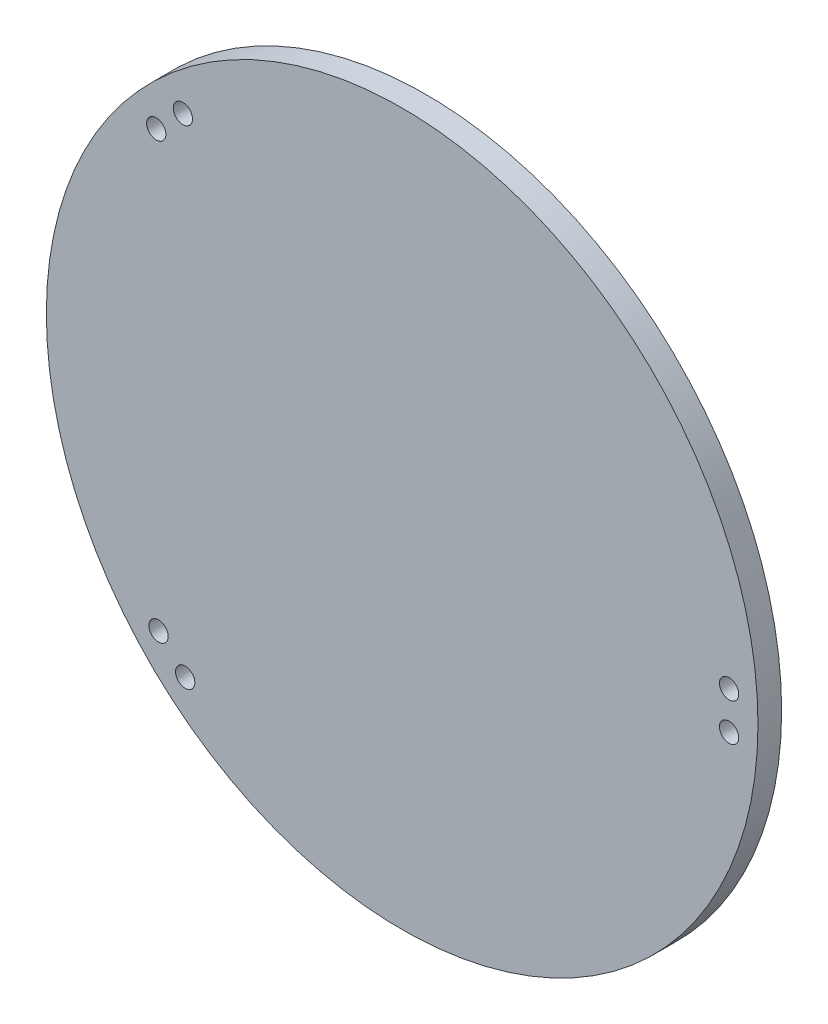
ISO-10303-21;
HEADER;
FILE_DESCRIPTION(('STEP AP214'),'2;1');
FILE_NAME('part.step','',(''),(''),'','','');
FILE_SCHEMA(('AUTOMOTIVE_DESIGN { 1 0 10303 214 1 1 1 1 }'));
ENDSEC;
DATA;
#1=APPLICATION_CONTEXT('core data for automotive mechanical design processes');
#2=APPLICATION_PROTOCOL_DEFINITION('international standard','automotive_design',2000,#1);
#3=PRODUCT_CONTEXT('',#1,'mechanical');
#4=PRODUCT('Part','Part','',(#3));
#5=PRODUCT_RELATED_PRODUCT_CATEGORY('part','',(#4));
#6=PRODUCT_DEFINITION_FORMATION('','',#4);
#7=PRODUCT_DEFINITION_CONTEXT('part definition',#1,'design');
#8=PRODUCT_DEFINITION('design','',#6,#7);
#9=PRODUCT_DEFINITION_SHAPE('','',#8);
#10=(LENGTH_UNIT() NAMED_UNIT(*) SI_UNIT(.MILLI.,.METRE.));
#11=(NAMED_UNIT(*) PLANE_ANGLE_UNIT() SI_UNIT($,.RADIAN.));
#12=(NAMED_UNIT(*) SI_UNIT($,.STERADIAN.) SOLID_ANGLE_UNIT());
#13=UNCERTAINTY_MEASURE_WITH_UNIT(LENGTH_MEASURE(1.E-05),#10,'distance_accuracy_value','');
#14=(GEOMETRIC_REPRESENTATION_CONTEXT(3) GLOBAL_UNCERTAINTY_ASSIGNED_CONTEXT((#13)) GLOBAL_UNIT_ASSIGNED_CONTEXT((#10,
#11,#12)) REPRESENTATION_CONTEXT('',''));
#15=CARTESIAN_POINT('',(0.,0.,0.));
#16=DIRECTION('',(0.,0.,1.));
#17=DIRECTION('',(1.,0.,0.));
#18=AXIS2_PLACEMENT_3D('',#15,#16,#17);
#19=CARTESIAN_POINT('',(102.75,82.324996948242,0.));
#20=DIRECTION('',(0.,0.,-1.));
#21=DIRECTION('',(0.,-1.,0.));
#22=AXIS2_PLACEMENT_3D('',#19,#20,#21);
#23=PLANE('',#22);
#24=CARTESIAN_POINT('',(101.77500092,81.60500316,0.));
#25=DIRECTION('',(0.,0.,1.));
#26=DIRECTION('',(1.,0.,0.));
#27=AXIS2_PLACEMENT_3D('',#24,#25,#26);
#28=CIRCLE('',#27,0.32500062);
#29=CARTESIAN_POINT('',(102.10000154,81.60500316,0.));
#30=VERTEX_POINT('',#29);
#31=EDGE_CURVE('E27',#30,#30,#28,.T.);
#32=ORIENTED_EDGE('',*,*,#31,.F.);
#33=EDGE_LOOP('',(#32));
#34=FACE_BOUND('',#33,.T.);
#35=CARTESIAN_POINT('',(101.77500092,82.87500062,0.));
#36=DIRECTION('',(0.,0.,1.));
#37=DIRECTION('',(1.,0.,0.));
#38=AXIS2_PLACEMENT_3D('',#35,#36,#37);
#39=CIRCLE('',#38,0.32500062);
#40=CARTESIAN_POINT('',(102.10000154,82.87500062,0.));
#41=VERTEX_POINT('',#40);
#42=EDGE_CURVE('E105',#41,#41,#39,.T.);
#43=ORIENTED_EDGE('',*,*,#42,.F.);
#44=EDGE_LOOP('',(#43));
#45=FACE_BOUND('',#44,.T.);
#46=CARTESIAN_POINT('',(83.43210898,74.04288976,0.));
#47=DIRECTION('',(0.,0.,1.));
#48=DIRECTION('',(1.,0.,0.));
#49=AXIS2_PLACEMENT_3D('',#46,#47,#48);
#50=CIRCLE('',#49,0.32500062);
#51=CARTESIAN_POINT('',(83.7571096,74.04288976,0.));
#52=VERTEX_POINT('',#51);
#53=EDGE_CURVE('E117',#52,#52,#50,.T.);
#54=ORIENTED_EDGE('',*,*,#53,.F.);
#55=EDGE_LOOP('',(#54));
#56=FACE_BOUND('',#55,.T.);
#57=CARTESIAN_POINT('',(83.35513174,90.46591508,0.));
#58=DIRECTION('',(0.,0.,1.));
#59=DIRECTION('',(1.,0.,0.));
#60=AXIS2_PLACEMENT_3D('',#57,#58,#59);
#61=CIRCLE('',#60,0.32500062);
#62=CARTESIAN_POINT('',(83.68013236,90.46591508,0.));
#63=VERTEX_POINT('',#62);
#64=EDGE_CURVE('E77',#63,#63,#61,.T.);
#65=ORIENTED_EDGE('',*,*,#64,.F.);
#66=EDGE_LOOP('',(#65));
#67=FACE_BOUND('',#66,.T.);
#68=CARTESIAN_POINT('',(82.45710712,89.56789046,0.));
#69=DIRECTION('',(0.,0.,1.));
#70=DIRECTION('',(1.,0.,0.));
#71=AXIS2_PLACEMENT_3D('',#68,#69,#70);
#72=CIRCLE('',#71,0.32500062);
#73=CARTESIAN_POINT('',(82.78210774,89.56789046,0.));
#74=VERTEX_POINT('',#73);
#75=EDGE_CURVE('E143',#74,#74,#72,.T.);
#76=ORIENTED_EDGE('',*,*,#75,.F.);
#77=EDGE_LOOP('',(#76));
#78=FACE_BOUND('',#77,.T.);
#79=CARTESIAN_POINT('',(82.53408436,74.94091438,0.));
#80=DIRECTION('',(0.,0.,1.));
#81=DIRECTION('',(1.,0.,0.));
#82=AXIS2_PLACEMENT_3D('',#79,#80,#81);
#83=CIRCLE('',#82,0.32500062);
#84=CARTESIAN_POINT('',(82.85908498,74.94091438,0.));
#85=VERTEX_POINT('',#84);
#86=EDGE_CURVE('E126',#85,#85,#83,.T.);
#87=ORIENTED_EDGE('',*,*,#86,.F.);
#88=EDGE_LOOP('',(#87));
#89=FACE_BOUND('',#88,.T.);
#90=CARTESIAN_POINT('',(90.75,82.324996948242,0.));
#91=DIRECTION('',(0.,0.,1.));
#92=DIRECTION('',(1.,0.,0.));
#93=AXIS2_PLACEMENT_3D('',#90,#91,#92);
#94=CIRCLE('',#93,12.);
#95=CARTESIAN_POINT('',(102.75,82.324996948242,0.));
#96=VERTEX_POINT('',#95);
#97=EDGE_CURVE('E118',#96,#96,#94,.T.);
#98=ORIENTED_EDGE('',*,*,#97,.T.);
#99=EDGE_LOOP('',(#98));
#100=FACE_BOUND('',#99,.T.);
#101=ADVANCED_FACE('F16',(#34,#45,#56,#67,#78,#89,#100),#23,.F.);
#102=CARTESIAN_POINT('',(102.75,82.324996948242,-0.79843884));
#103=DIRECTION('',(0.,0.,-1.));
#104=DIRECTION('',(0.,-1.,0.));
#105=AXIS2_PLACEMENT_3D('',#102,#103,#104);
#106=PLANE('',#105);
#107=CARTESIAN_POINT('',(101.77500092,81.60500316,-0.79843884));
#108=DIRECTION('',(0.,0.,1.));
#109=DIRECTION('',(1.,0.,0.));
#110=AXIS2_PLACEMENT_3D('',#107,#108,#109);
#111=CIRCLE('',#110,0.32500062);
#112=CARTESIAN_POINT('',(102.10000154,81.60500316,-0.79843884));
#113=VERTEX_POINT('',#112);
#114=EDGE_CURVE('E11',#113,#113,#111,.T.);
#115=ORIENTED_EDGE('',*,*,#114,.T.);
#116=EDGE_LOOP('',(#115));
#117=FACE_BOUND('',#116,.T.);
#118=CARTESIAN_POINT('',(101.77500092,82.87500062,-0.79843884));
#119=DIRECTION('',(0.,0.,1.));
#120=DIRECTION('',(1.,0.,0.));
#121=AXIS2_PLACEMENT_3D('',#118,#119,#120);
#122=CIRCLE('',#121,0.32500062);
#123=CARTESIAN_POINT('',(102.10000154,82.87500062,-0.79843884));
#124=VERTEX_POINT('',#123);
#125=EDGE_CURVE('E98',#124,#124,#122,.T.);
#126=ORIENTED_EDGE('',*,*,#125,.T.);
#127=EDGE_LOOP('',(#126));
#128=FACE_BOUND('',#127,.T.);
#129=CARTESIAN_POINT('',(83.43210898,74.04288976,-0.79843884));
#130=DIRECTION('',(0.,0.,1.));
#131=DIRECTION('',(1.,0.,0.));
#132=AXIS2_PLACEMENT_3D('',#129,#130,#131);
#133=CIRCLE('',#132,0.32500062);
#134=CARTESIAN_POINT('',(83.7571096,74.04288976,-0.79843884));
#135=VERTEX_POINT('',#134);
#136=EDGE_CURVE('E86',#135,#135,#133,.T.);
#137=ORIENTED_EDGE('',*,*,#136,.T.);
#138=EDGE_LOOP('',(#137));
#139=FACE_BOUND('',#138,.T.);
#140=CARTESIAN_POINT('',(83.35513174,90.46591508,-0.79843884));
#141=DIRECTION('',(0.,0.,1.));
#142=DIRECTION('',(1.,0.,0.));
#143=AXIS2_PLACEMENT_3D('',#140,#141,#142);
#144=CIRCLE('',#143,0.32500062);
#145=CARTESIAN_POINT('',(83.68013236,90.46591508,-0.79843884));
#146=VERTEX_POINT('',#145);
#147=EDGE_CURVE('E149',#146,#146,#144,.T.);
#148=ORIENTED_EDGE('',*,*,#147,.T.);
#149=EDGE_LOOP('',(#148));
#150=FACE_BOUND('',#149,.T.);
#151=CARTESIAN_POINT('',(82.45710712,89.56789046,-0.79843884));
#152=DIRECTION('',(0.,0.,1.));
#153=DIRECTION('',(1.,0.,0.));
#154=AXIS2_PLACEMENT_3D('',#151,#152,#153);
#155=CIRCLE('',#154,0.32500062);
#156=CARTESIAN_POINT('',(82.78210774,89.56789046,-0.79843884));
#157=VERTEX_POINT('',#156);
#158=EDGE_CURVE('E132',#157,#157,#155,.T.);
#159=ORIENTED_EDGE('',*,*,#158,.T.);
#160=EDGE_LOOP('',(#159));
#161=FACE_BOUND('',#160,.T.);
#162=CARTESIAN_POINT('',(82.53408436,74.94091438,-0.79843884));
#163=DIRECTION('',(0.,0.,1.));
#164=DIRECTION('',(1.,0.,0.));
#165=AXIS2_PLACEMENT_3D('',#162,#163,#164);
#166=CIRCLE('',#165,0.32500062);
#167=CARTESIAN_POINT('',(82.85908498,74.94091438,-0.79843884));
#168=VERTEX_POINT('',#167);
#169=EDGE_CURVE('E20',#168,#168,#166,.T.);
#170=ORIENTED_EDGE('',*,*,#169,.T.);
#171=EDGE_LOOP('',(#170));
#172=FACE_BOUND('',#171,.T.);
#173=CARTESIAN_POINT('',(90.75,82.324996948242,-0.79843884));
#174=DIRECTION('',(0.,0.,1.));
#175=DIRECTION('',(1.,0.,0.));
#176=AXIS2_PLACEMENT_3D('',#173,#174,#175);
#177=CIRCLE('',#176,12.);
#178=CARTESIAN_POINT('',(102.75,82.324996948242,-0.79843884));
#179=VERTEX_POINT('',#178);
#180=EDGE_CURVE('E135',#179,#179,#177,.T.);
#181=ORIENTED_EDGE('',*,*,#180,.F.);
#182=EDGE_LOOP('',(#181));
#183=FACE_BOUND('',#182,.T.);
#184=ADVANCED_FACE('F99',(#117,#128,#139,#150,#161,#172,#183),#106,.T.);
#185=CARTESIAN_POINT('',(101.77500092,81.60500316,-0.79843884));
#186=DIRECTION('',(0.,0.,-1.));
#187=DIRECTION('',(1.,0.,0.));
#188=AXIS2_PLACEMENT_3D('',#185,#186,#187);
#189=CYLINDRICAL_SURFACE('',#188,0.32500062);
#190=DIRECTION('',(0.,0.,1.));
#191=VECTOR('',#190,1.);
#192=CARTESIAN_POINT('',(102.10000154,81.60500316,-0.79843884));
#193=LINE('',#192,#191);
#194=EDGE_CURVE('E104',#113,#30,#193,.T.);
#195=ORIENTED_EDGE('',*,*,#194,.T.);
#196=ORIENTED_EDGE('',*,*,#31,.T.);
#197=ORIENTED_EDGE('',*,*,#194,.F.);
#198=ORIENTED_EDGE('',*,*,#114,.F.);
#199=EDGE_LOOP('',(#195,#196,#197,#198));
#200=FACE_BOUND('',#199,.T.);
#201=ADVANCED_FACE('F195',(#200),#189,.F.);
#202=CARTESIAN_POINT('',(101.77500092,82.87500062,-0.79843884));
#203=DIRECTION('',(0.,0.,-1.));
#204=DIRECTION('',(1.,0.,0.));
#205=AXIS2_PLACEMENT_3D('',#202,#203,#204);
#206=CYLINDRICAL_SURFACE('',#205,0.32500062);
#207=DIRECTION('',(0.,0.,1.));
#208=VECTOR('',#207,1.);
#209=CARTESIAN_POINT('',(102.10000154,82.87500062,-0.79843884));
#210=LINE('',#209,#208);
#211=EDGE_CURVE('E113',#124,#41,#210,.T.);
#212=ORIENTED_EDGE('',*,*,#211,.T.);
#213=ORIENTED_EDGE('',*,*,#42,.T.);
#214=ORIENTED_EDGE('',*,*,#211,.F.);
#215=ORIENTED_EDGE('',*,*,#125,.F.);
#216=EDGE_LOOP('',(#212,#213,#214,#215));
#217=FACE_BOUND('',#216,.T.);
#218=ADVANCED_FACE('F205',(#217),#206,.F.);
#219=CARTESIAN_POINT('',(83.43210898,74.04288976,-0.79843884));
#220=DIRECTION('',(0.,0.,-1.));
#221=DIRECTION('',(1.,0.,0.));
#222=AXIS2_PLACEMENT_3D('',#219,#220,#221);
#223=CYLINDRICAL_SURFACE('',#222,0.32500062);
#224=DIRECTION('',(0.,0.,1.));
#225=VECTOR('',#224,1.);
#226=CARTESIAN_POINT('',(83.7571096,74.04288976,-0.79843884));
#227=LINE('',#226,#225);
#228=EDGE_CURVE('E151',#135,#52,#227,.T.);
#229=ORIENTED_EDGE('',*,*,#228,.T.);
#230=ORIENTED_EDGE('',*,*,#53,.T.);
#231=ORIENTED_EDGE('',*,*,#228,.F.);
#232=ORIENTED_EDGE('',*,*,#136,.F.);
#233=EDGE_LOOP('',(#229,#230,#231,#232));
#234=FACE_BOUND('',#233,.T.);
#235=ADVANCED_FACE('F202',(#234),#223,.F.);
#236=CARTESIAN_POINT('',(83.35513174,90.46591508,-0.79843884));
#237=DIRECTION('',(0.,0.,-1.));
#238=DIRECTION('',(1.,0.,0.));
#239=AXIS2_PLACEMENT_3D('',#236,#237,#238);
#240=CYLINDRICAL_SURFACE('',#239,0.32500062);
#241=DIRECTION('',(0.,0.,1.));
#242=VECTOR('',#241,1.);
#243=CARTESIAN_POINT('',(83.68013236,90.46591508,-0.79843884));
#244=LINE('',#243,#242);
#245=EDGE_CURVE('E129',#146,#63,#244,.T.);
#246=ORIENTED_EDGE('',*,*,#245,.T.);
#247=ORIENTED_EDGE('',*,*,#64,.T.);
#248=ORIENTED_EDGE('',*,*,#245,.F.);
#249=ORIENTED_EDGE('',*,*,#147,.F.);
#250=EDGE_LOOP('',(#246,#247,#248,#249));
#251=FACE_BOUND('',#250,.T.);
#252=ADVANCED_FACE('F186',(#251),#240,.F.);
#253=CARTESIAN_POINT('',(82.45710712,89.56789046,-0.79843884));
#254=DIRECTION('',(0.,0.,-1.));
#255=DIRECTION('',(1.,0.,0.));
#256=AXIS2_PLACEMENT_3D('',#253,#254,#255);
#257=CYLINDRICAL_SURFACE('',#256,0.32500062);
#258=DIRECTION('',(0.,0.,1.));
#259=VECTOR('',#258,1.);
#260=CARTESIAN_POINT('',(82.78210774,89.56789046,-0.79843884));
#261=LINE('',#260,#259);
#262=EDGE_CURVE('E147',#157,#74,#261,.T.);
#263=ORIENTED_EDGE('',*,*,#262,.T.);
#264=ORIENTED_EDGE('',*,*,#75,.T.);
#265=ORIENTED_EDGE('',*,*,#262,.F.);
#266=ORIENTED_EDGE('',*,*,#158,.F.);
#267=EDGE_LOOP('',(#263,#264,#265,#266));
#268=FACE_BOUND('',#267,.T.);
#269=ADVANCED_FACE('F18',(#268),#257,.F.);
#270=CARTESIAN_POINT('',(82.53408436,74.94091438,-0.79843884));
#271=DIRECTION('',(0.,0.,-1.));
#272=DIRECTION('',(1.,0.,0.));
#273=AXIS2_PLACEMENT_3D('',#270,#271,#272);
#274=CYLINDRICAL_SURFACE('',#273,0.32500062);
#275=DIRECTION('',(0.,0.,1.));
#276=VECTOR('',#275,1.);
#277=CARTESIAN_POINT('',(82.85908498,74.94091438,-0.79843884));
#278=LINE('',#277,#276);
#279=EDGE_CURVE('E121',#168,#85,#278,.T.);
#280=ORIENTED_EDGE('',*,*,#279,.T.);
#281=ORIENTED_EDGE('',*,*,#86,.T.);
#282=ORIENTED_EDGE('',*,*,#279,.F.);
#283=ORIENTED_EDGE('',*,*,#169,.F.);
#284=EDGE_LOOP('',(#280,#281,#282,#283));
#285=FACE_BOUND('',#284,.T.);
#286=ADVANCED_FACE('F174',(#285),#274,.F.);
#287=CARTESIAN_POINT('',(90.75,82.324996948242,-0.79843884));
#288=DIRECTION('',(0.,0.,-1.));
#289=DIRECTION('',(1.,0.,0.));
#290=AXIS2_PLACEMENT_3D('',#287,#288,#289);
#291=CYLINDRICAL_SURFACE('',#290,12.);
#292=ORIENTED_EDGE('',*,*,#180,.T.);
#293=DIRECTION('',(0.,0.,1.));
#294=VECTOR('',#293,1.);
#295=CARTESIAN_POINT('',(102.75,82.324996948242,-0.79843884));
#296=LINE('',#295,#294);
#297=EDGE_CURVE('E122',#179,#96,#296,.T.);
#298=ORIENTED_EDGE('',*,*,#297,.T.);
#299=ORIENTED_EDGE('',*,*,#97,.F.);
#300=ORIENTED_EDGE('',*,*,#297,.F.);
#301=EDGE_LOOP('',(#292,#298,#299,#300));
#302=FACE_BOUND('',#301,.T.);
#303=ADVANCED_FACE('F176',(#302),#291,.T.);
#304=CLOSED_SHELL('',(#101,#184,#201,#218,#235,#252,#269,#286,#303));
#305=MANIFOLD_SOLID_BREP('B1',#304);
#306=ADVANCED_BREP_SHAPE_REPRESENTATION('',(#18,#305),#14);
#307=SHAPE_DEFINITION_REPRESENTATION(#9,#306);
ENDSEC;
END-ISO-10303-21;
